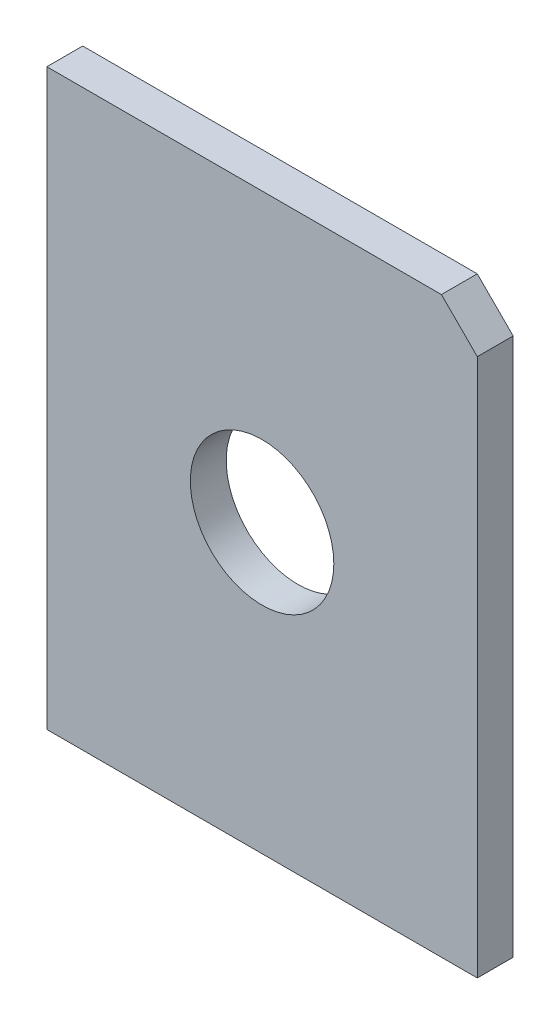
ISO-10303-21;
HEADER;
FILE_DESCRIPTION(('STEP AP214'),'2;1');
FILE_NAME('part.step','',(''),(''),'','','');
FILE_SCHEMA(('AUTOMOTIVE_DESIGN { 1 0 10303 214 1 1 1 1 }'));
ENDSEC;
DATA;
#1=APPLICATION_CONTEXT('core data for automotive mechanical design processes');
#2=APPLICATION_PROTOCOL_DEFINITION('international standard','automotive_design',2000,#1);
#3=PRODUCT_CONTEXT('',#1,'mechanical');
#4=PRODUCT('Part','Part','',(#3));
#5=PRODUCT_RELATED_PRODUCT_CATEGORY('part','',(#4));
#6=PRODUCT_DEFINITION_FORMATION('','',#4);
#7=PRODUCT_DEFINITION_CONTEXT('part definition',#1,'design');
#8=PRODUCT_DEFINITION('design','',#6,#7);
#9=PRODUCT_DEFINITION_SHAPE('','',#8);
#10=(LENGTH_UNIT() NAMED_UNIT(*) SI_UNIT(.MILLI.,.METRE.));
#11=(NAMED_UNIT(*) PLANE_ANGLE_UNIT() SI_UNIT($,.RADIAN.));
#12=(NAMED_UNIT(*) SI_UNIT($,.STERADIAN.) SOLID_ANGLE_UNIT());
#13=UNCERTAINTY_MEASURE_WITH_UNIT(LENGTH_MEASURE(1.E-05),#10,'distance_accuracy_value','');
#14=(GEOMETRIC_REPRESENTATION_CONTEXT(3) GLOBAL_UNCERTAINTY_ASSIGNED_CONTEXT((#13)) GLOBAL_UNIT_ASSIGNED_CONTEXT((#10,
#11,#12)) REPRESENTATION_CONTEXT('',''));
#15=CARTESIAN_POINT('',(0.,0.,0.));
#16=DIRECTION('',(0.,0.,1.));
#17=DIRECTION('',(1.,0.,0.));
#18=AXIS2_PLACEMENT_3D('',#15,#16,#17);
#19=CARTESIAN_POINT('',(0.,0.,-5.));
#20=DIRECTION('',(-1.,0.,0.));
#21=DIRECTION('',(0.,0.,1.));
#22=AXIS2_PLACEMENT_3D('',#19,#20,#21);
#23=PLANE('',#22);
#24=DIRECTION('',(0.,-1.,0.));
#25=VECTOR('',#24,1.);
#26=CARTESIAN_POINT('',(0.,0.,0.));
#27=LINE('',#26,#25);
#28=CARTESIAN_POINT('',(0.,80.,0.));
#29=VERTEX_POINT('',#28);
#30=CARTESIAN_POINT('',(0.,0.,0.));
#31=VERTEX_POINT('',#30);
#32=EDGE_CURVE('E115',#29,#31,#27,.T.);
#33=ORIENTED_EDGE('',*,*,#32,.F.);
#34=DIRECTION('',(0.,0.,1.));
#35=VECTOR('',#34,1.);
#36=CARTESIAN_POINT('',(0.,80.,-5.));
#37=LINE('',#36,#35);
#38=CARTESIAN_POINT('',(0.,80.,-5.));
#39=VERTEX_POINT('',#38);
#40=EDGE_CURVE('E11',#39,#29,#37,.T.);
#41=ORIENTED_EDGE('',*,*,#40,.F.);
#42=DIRECTION('',(0.,-1.,0.));
#43=VECTOR('',#42,1.);
#44=CARTESIAN_POINT('',(0.,0.,-5.));
#45=LINE('',#44,#43);
#46=CARTESIAN_POINT('',(0.,0.,-5.));
#47=VERTEX_POINT('',#46);
#48=EDGE_CURVE('E110',#39,#47,#45,.T.);
#49=ORIENTED_EDGE('',*,*,#48,.T.);
#50=DIRECTION('',(0.,0.,1.));
#51=VECTOR('',#50,1.);
#52=CARTESIAN_POINT('',(0.,0.,-5.));
#53=LINE('',#52,#51);
#54=EDGE_CURVE('E41',#47,#31,#53,.T.);
#55=ORIENTED_EDGE('',*,*,#54,.T.);
#56=EDGE_LOOP('',(#33,#41,#49,#55));
#57=FACE_BOUND('',#56,.T.);
#58=ADVANCED_FACE('F38',(#57),#23,.T.);
#59=CARTESIAN_POINT('',(0.,80.,-5.));
#60=DIRECTION('',(0.,1.,0.));
#61=DIRECTION('',(0.,0.,1.));
#62=AXIS2_PLACEMENT_3D('',#59,#60,#61);
#63=PLANE('',#62);
#64=DIRECTION('',(-1.,0.,0.));
#65=VECTOR('',#64,1.);
#66=CARTESIAN_POINT('',(0.,80.,0.));
#67=LINE('',#66,#65);
#68=CARTESIAN_POINT('',(55.,80.,0.));
#69=VERTEX_POINT('',#68);
#70=EDGE_CURVE('E125',#69,#29,#67,.T.);
#71=ORIENTED_EDGE('',*,*,#70,.F.);
#72=DIRECTION('',(0.,0.,1.));
#73=VECTOR('',#72,1.);
#74=CARTESIAN_POINT('',(55.,80.,-5.));
#75=LINE('',#74,#73);
#76=CARTESIAN_POINT('',(55.,80.,-5.));
#77=VERTEX_POINT('',#76);
#78=EDGE_CURVE('E47',#77,#69,#75,.T.);
#79=ORIENTED_EDGE('',*,*,#78,.F.);
#80=DIRECTION('',(-1.,0.,0.));
#81=VECTOR('',#80,1.);
#82=CARTESIAN_POINT('',(0.,80.,-5.));
#83=LINE('',#82,#81);
#84=EDGE_CURVE('E105',#77,#39,#83,.T.);
#85=ORIENTED_EDGE('',*,*,#84,.T.);
#86=ORIENTED_EDGE('',*,*,#40,.T.);
#87=EDGE_LOOP('',(#71,#79,#85,#86));
#88=FACE_BOUND('',#87,.T.);
#89=ADVANCED_FACE('F131',(#88),#63,.T.);
#90=CARTESIAN_POINT('',(55.,80.,-5.));
#91=DIRECTION('',(0.707106781186548,0.707106781186547,0.));
#92=DIRECTION('',(-0.707106781186547,0.707106781186548,0.));
#93=AXIS2_PLACEMENT_3D('',#90,#91,#92);
#94=PLANE('',#93);
#95=DIRECTION('',(-0.707106781186547,0.707106781186548,0.));
#96=VECTOR('',#95,1.);
#97=CARTESIAN_POINT('',(55.,80.,0.));
#98=LINE('',#97,#96);
#99=CARTESIAN_POINT('',(60.,75.,0.));
#100=VERTEX_POINT('',#99);
#101=EDGE_CURVE('E94',#100,#69,#98,.T.);
#102=ORIENTED_EDGE('',*,*,#101,.F.);
#103=DIRECTION('',(0.,0.,1.));
#104=VECTOR('',#103,1.);
#105=CARTESIAN_POINT('',(60.,75.,-5.));
#106=LINE('',#105,#104);
#107=CARTESIAN_POINT('',(60.,75.,-5.));
#108=VERTEX_POINT('',#107);
#109=EDGE_CURVE('E89',#108,#100,#106,.T.);
#110=ORIENTED_EDGE('',*,*,#109,.F.);
#111=DIRECTION('',(-0.707106781186547,0.707106781186548,0.));
#112=VECTOR('',#111,1.);
#113=CARTESIAN_POINT('',(55.,80.,-5.));
#114=LINE('',#113,#112);
#115=EDGE_CURVE('E92',#108,#77,#114,.T.);
#116=ORIENTED_EDGE('',*,*,#115,.T.);
#117=ORIENTED_EDGE('',*,*,#78,.T.);
#118=EDGE_LOOP('',(#102,#110,#116,#117));
#119=FACE_BOUND('',#118,.T.);
#120=ADVANCED_FACE('F91',(#119),#94,.T.);
#121=CARTESIAN_POINT('',(60.,0.,-5.));
#122=DIRECTION('',(1.,0.,0.));
#123=DIRECTION('',(0.,0.,-1.));
#124=AXIS2_PLACEMENT_3D('',#121,#122,#123);
#125=PLANE('',#124);
#126=DIRECTION('',(0.,1.,0.));
#127=VECTOR('',#126,1.);
#128=CARTESIAN_POINT('',(60.,0.,0.));
#129=LINE('',#128,#127);
#130=CARTESIAN_POINT('',(60.,0.,0.));
#131=VERTEX_POINT('',#130);
#132=EDGE_CURVE('E122',#131,#100,#129,.T.);
#133=ORIENTED_EDGE('',*,*,#132,.F.);
#134=DIRECTION('',(0.,0.,1.));
#135=VECTOR('',#134,1.);
#136=CARTESIAN_POINT('',(60.,0.,-5.));
#137=LINE('',#136,#135);
#138=CARTESIAN_POINT('',(60.,0.,-5.));
#139=VERTEX_POINT('',#138);
#140=EDGE_CURVE('E99',#139,#131,#137,.T.);
#141=ORIENTED_EDGE('',*,*,#140,.F.);
#142=DIRECTION('',(0.,1.,0.));
#143=VECTOR('',#142,1.);
#144=CARTESIAN_POINT('',(60.,0.,-5.));
#145=LINE('',#144,#143);
#146=EDGE_CURVE('E104',#139,#108,#145,.T.);
#147=ORIENTED_EDGE('',*,*,#146,.T.);
#148=ORIENTED_EDGE('',*,*,#109,.T.);
#149=EDGE_LOOP('',(#133,#141,#147,#148));
#150=FACE_BOUND('',#149,.T.);
#151=ADVANCED_FACE('F107',(#150),#125,.T.);
#152=CARTESIAN_POINT('',(0.,0.,-5.));
#153=DIRECTION('',(0.,-1.,0.));
#154=DIRECTION('',(0.,0.,-1.));
#155=AXIS2_PLACEMENT_3D('',#152,#153,#154);
#156=PLANE('',#155);
#157=DIRECTION('',(1.,0.,0.));
#158=VECTOR('',#157,1.);
#159=CARTESIAN_POINT('',(0.,0.,0.));
#160=LINE('',#159,#158);
#161=EDGE_CURVE('E118',#31,#131,#160,.T.);
#162=ORIENTED_EDGE('',*,*,#161,.F.);
#163=ORIENTED_EDGE('',*,*,#54,.F.);
#164=DIRECTION('',(1.,0.,0.));
#165=VECTOR('',#164,1.);
#166=CARTESIAN_POINT('',(0.,0.,-5.));
#167=LINE('',#166,#165);
#168=EDGE_CURVE('E108',#47,#139,#167,.T.);
#169=ORIENTED_EDGE('',*,*,#168,.T.);
#170=ORIENTED_EDGE('',*,*,#140,.T.);
#171=EDGE_LOOP('',(#162,#163,#169,#170));
#172=FACE_BOUND('',#171,.T.);
#173=ADVANCED_FACE('F128',(#172),#156,.T.);
#174=CARTESIAN_POINT('',(0.,80.,-5.));
#175=DIRECTION('',(0.,0.,-1.));
#176=DIRECTION('',(-1.,0.,0.));
#177=AXIS2_PLACEMENT_3D('',#174,#175,#176);
#178=PLANE('',#177);
#179=CARTESIAN_POINT('',(30.,40.,-5.));
#180=DIRECTION('',(0.,0.,1.));
#181=DIRECTION('',(1.,0.,0.));
#182=AXIS2_PLACEMENT_3D('',#179,#180,#181);
#183=CIRCLE('',#182,10.);
#184=CARTESIAN_POINT('',(40.,40.,-5.));
#185=VERTEX_POINT('',#184);
#186=EDGE_CURVE('E119',#185,#185,#183,.T.);
#187=ORIENTED_EDGE('',*,*,#186,.T.);
#188=EDGE_LOOP('',(#187));
#189=FACE_BOUND('',#188,.T.);
#190=ORIENTED_EDGE('',*,*,#48,.F.);
#191=ORIENTED_EDGE('',*,*,#84,.F.);
#192=ORIENTED_EDGE('',*,*,#115,.F.);
#193=ORIENTED_EDGE('',*,*,#146,.F.);
#194=ORIENTED_EDGE('',*,*,#168,.F.);
#195=EDGE_LOOP('',(#190,#191,#192,#193,#194));
#196=FACE_BOUND('',#195,.T.);
#197=ADVANCED_FACE('F103',(#189,#196),#178,.T.);
#198=CARTESIAN_POINT('',(0.,80.,0.));
#199=DIRECTION('',(0.,0.,-1.));
#200=DIRECTION('',(-1.,0.,0.));
#201=AXIS2_PLACEMENT_3D('',#198,#199,#200);
#202=PLANE('',#201);
#203=CARTESIAN_POINT('',(30.,40.,0.));
#204=DIRECTION('',(0.,0.,1.));
#205=DIRECTION('',(1.,0.,0.));
#206=AXIS2_PLACEMENT_3D('',#203,#204,#205);
#207=CIRCLE('',#206,10.);
#208=CARTESIAN_POINT('',(40.,40.,0.));
#209=VERTEX_POINT('',#208);
#210=EDGE_CURVE('E163',#209,#209,#207,.T.);
#211=ORIENTED_EDGE('',*,*,#210,.F.);
#212=EDGE_LOOP('',(#211));
#213=FACE_BOUND('',#212,.T.);
#214=ORIENTED_EDGE('',*,*,#32,.T.);
#215=ORIENTED_EDGE('',*,*,#161,.T.);
#216=ORIENTED_EDGE('',*,*,#132,.T.);
#217=ORIENTED_EDGE('',*,*,#101,.T.);
#218=ORIENTED_EDGE('',*,*,#70,.T.);
#219=EDGE_LOOP('',(#214,#215,#216,#217,#218));
#220=FACE_BOUND('',#219,.T.);
#221=ADVANCED_FACE('F130',(#213,#220),#202,.F.);
#222=CARTESIAN_POINT('',(30.,40.,-5.));
#223=DIRECTION('',(0.,0.,1.));
#224=DIRECTION('',(1.,0.,0.));
#225=AXIS2_PLACEMENT_3D('',#222,#223,#224);
#226=CYLINDRICAL_SURFACE('',#225,10.);
#227=ORIENTED_EDGE('',*,*,#186,.F.);
#228=EDGE_LOOP('',(#227));
#229=FACE_BOUND('',#228,.T.);
#230=ORIENTED_EDGE('',*,*,#210,.T.);
#231=EDGE_LOOP('',(#230));
#232=FACE_BOUND('',#231,.T.);
#233=ADVANCED_FACE('F151',(#229,#232),#226,.F.);
#234=CLOSED_SHELL('',(#58,#89,#120,#151,#173,#197,#221,#233));
#235=MANIFOLD_SOLID_BREP('B2',#234);
#236=ADVANCED_BREP_SHAPE_REPRESENTATION('',(#18,#235),#14);
#237=SHAPE_DEFINITION_REPRESENTATION(#9,#236);
ENDSEC;
END-ISO-10303-21;
